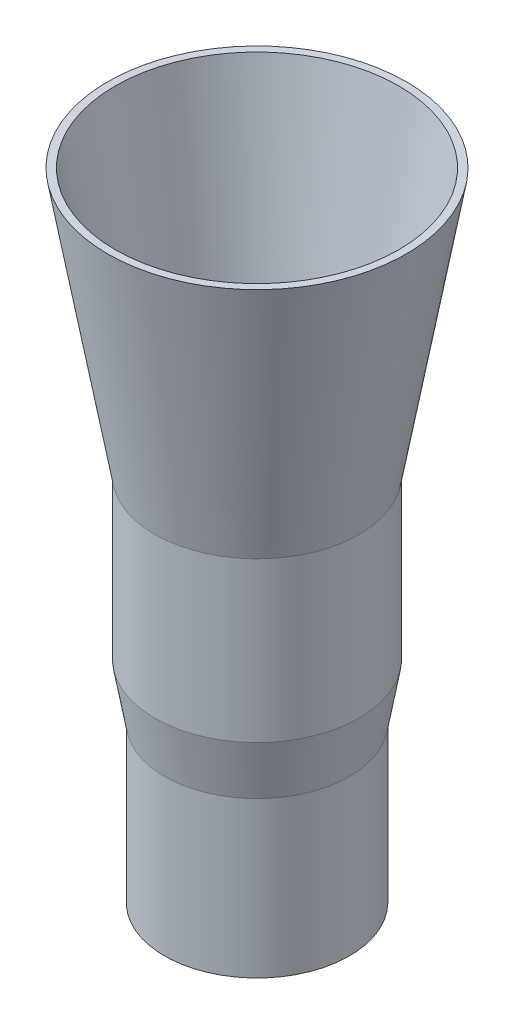
ISO-10303-21;
HEADER;
FILE_DESCRIPTION(('STEP AP214'),'2;1');
FILE_NAME('part.step','',(''),(''),'','','');
FILE_SCHEMA(('AUTOMOTIVE_DESIGN { 1 0 10303 214 1 1 1 1 }'));
ENDSEC;
DATA;
#1=APPLICATION_CONTEXT('core data for automotive mechanical design processes');
#2=APPLICATION_PROTOCOL_DEFINITION('international standard','automotive_design',2000,#1);
#3=PRODUCT_CONTEXT('',#1,'mechanical');
#4=PRODUCT('Part','Part','',(#3));
#5=PRODUCT_RELATED_PRODUCT_CATEGORY('part','',(#4));
#6=PRODUCT_DEFINITION_FORMATION('','',#4);
#7=PRODUCT_DEFINITION_CONTEXT('part definition',#1,'design');
#8=PRODUCT_DEFINITION('design','',#6,#7);
#9=PRODUCT_DEFINITION_SHAPE('','',#8);
#10=(LENGTH_UNIT() NAMED_UNIT(*) SI_UNIT(.MILLI.,.METRE.));
#11=(NAMED_UNIT(*) PLANE_ANGLE_UNIT() SI_UNIT($,.RADIAN.));
#12=(NAMED_UNIT(*) SI_UNIT($,.STERADIAN.) SOLID_ANGLE_UNIT());
#13=UNCERTAINTY_MEASURE_WITH_UNIT(LENGTH_MEASURE(1.E-05),#10,'distance_accuracy_value','');
#14=(GEOMETRIC_REPRESENTATION_CONTEXT(3) GLOBAL_UNCERTAINTY_ASSIGNED_CONTEXT((#13)) GLOBAL_UNIT_ASSIGNED_CONTEXT((#10,
#11,#12)) REPRESENTATION_CONTEXT('',''));
#15=CARTESIAN_POINT('',(0.,0.,0.));
#16=DIRECTION('',(0.,0.,1.));
#17=DIRECTION('',(1.,0.,0.));
#18=AXIS2_PLACEMENT_3D('',#15,#16,#17);
#19=CARTESIAN_POINT('',(0.,0.,0.));
#20=DIRECTION('',(0.,-1.,0.));
#21=DIRECTION('',(0.,0.,-1.));
#22=AXIS2_PLACEMENT_3D('',#19,#20,#21);
#23=PLANE('',#22);
#24=CARTESIAN_POINT('',(0.,0.,0.));
#25=DIRECTION('',(0.,-1.,0.));
#26=DIRECTION('',(0.,0.,-1.));
#27=AXIS2_PLACEMENT_3D('',#24,#25,#26);
#28=CIRCLE('',#27,250.);
#29=CARTESIAN_POINT('',(0.,0.,-250.));
#30=VERTEX_POINT('',#29);
#31=EDGE_CURVE('E10',#30,#30,#28,.T.);
#32=ORIENTED_EDGE('',*,*,#31,.T.);
#33=EDGE_LOOP('',(#32));
#34=FACE_BOUND('',#33,.T.);
#35=ADVANCED_FACE('F37',(#34),#23,.T.);
#36=CARTESIAN_POINT('',(0.,0.,0.));
#37=DIRECTION('',(0.,-1.,0.));
#38=DIRECTION('',(0.,0.,-1.));
#39=AXIS2_PLACEMENT_3D('',#36,#37,#38);
#40=CYLINDRICAL_SURFACE('',#39,250.);
#41=CARTESIAN_POINT('',(0.,420.,0.));
#42=DIRECTION('',(0.,-1.,0.));
#43=DIRECTION('',(0.,0.,-1.));
#44=AXIS2_PLACEMENT_3D('',#41,#42,#43);
#45=CIRCLE('',#44,250.);
#46=CARTESIAN_POINT('',(0.,420.,-250.));
#47=VERTEX_POINT('',#46);
#48=EDGE_CURVE('E44',#47,#47,#45,.T.);
#49=ORIENTED_EDGE('',*,*,#48,.T.);
#50=EDGE_LOOP('',(#49));
#51=FACE_BOUND('',#50,.T.);
#52=ORIENTED_EDGE('',*,*,#31,.F.);
#53=EDGE_LOOP('',(#52));
#54=FACE_BOUND('',#53,.T.);
#55=ADVANCED_FACE('F97',(#51,#54),#40,.T.);
#56=CARTESIAN_POINT('',(0.,420.,0.));
#57=DIRECTION('',(0.,1.,0.));
#58=DIRECTION('',(0.,0.,1.));
#59=AXIS2_PLACEMENT_3D('',#56,#57,#58);
#60=CONICAL_SURFACE('',#59,250.,0.174532925199433);
#61=CARTESIAN_POINT('',(0.,570.,0.));
#62=DIRECTION('',(0.,-1.,0.));
#63=DIRECTION('',(0.,0.,-1.));
#64=AXIS2_PLACEMENT_3D('',#61,#62,#63);
#65=CIRCLE('',#64,276.44904710627);
#66=CARTESIAN_POINT('',(0.,570.,-276.44904710627));
#67=VERTEX_POINT('',#66);
#68=EDGE_CURVE('E49',#67,#67,#65,.T.);
#69=ORIENTED_EDGE('',*,*,#68,.T.);
#70=EDGE_LOOP('',(#69));
#71=FACE_BOUND('',#70,.T.);
#72=ORIENTED_EDGE('',*,*,#48,.F.);
#73=EDGE_LOOP('',(#72));
#74=FACE_BOUND('',#73,.T.);
#75=ADVANCED_FACE('F101',(#71,#74),#60,.T.);
#76=CARTESIAN_POINT('',(0.,0.,0.));
#77=DIRECTION('',(0.,-1.,0.));
#78=DIRECTION('',(0.,0.,-1.));
#79=AXIS2_PLACEMENT_3D('',#76,#77,#78);
#80=CYLINDRICAL_SURFACE('',#79,276.44904710627);
#81=CARTESIAN_POINT('',(0.,1000.,0.));
#82=DIRECTION('',(0.,-1.,0.));
#83=DIRECTION('',(0.,0.,-1.));
#84=AXIS2_PLACEMENT_3D('',#81,#82,#83);
#85=CIRCLE('',#84,276.44904710627);
#86=CARTESIAN_POINT('',(0.,1000.,-276.44904710627));
#87=VERTEX_POINT('',#86);
#88=EDGE_CURVE('E54',#87,#87,#85,.T.);
#89=ORIENTED_EDGE('',*,*,#88,.T.);
#90=EDGE_LOOP('',(#89));
#91=FACE_BOUND('',#90,.T.);
#92=ORIENTED_EDGE('',*,*,#68,.F.);
#93=EDGE_LOOP('',(#92));
#94=FACE_BOUND('',#93,.T.);
#95=ADVANCED_FACE('F105',(#91,#94),#80,.T.);
#96=CARTESIAN_POINT('',(0.,1000.,0.));
#97=DIRECTION('',(0.,1.,0.));
#98=DIRECTION('',(0.,0.,1.));
#99=AXIS2_PLACEMENT_3D('',#96,#97,#98);
#100=CONICAL_SURFACE('',#99,276.44904710627,0.174532925199427);
#101=CARTESIAN_POINT('',(0.,1720.,0.));
#102=DIRECTION('',(0.,-1.,0.));
#103=DIRECTION('',(0.,0.,-1.));
#104=AXIS2_PLACEMENT_3D('',#101,#102,#103);
#105=CIRCLE('',#104,403.40447321636);
#106=CARTESIAN_POINT('',(0.,1720.,-403.40447321636));
#107=VERTEX_POINT('',#106);
#108=EDGE_CURVE('E60',#107,#107,#105,.T.);
#109=ORIENTED_EDGE('',*,*,#108,.T.);
#110=EDGE_LOOP('',(#109));
#111=FACE_BOUND('',#110,.T.);
#112=ORIENTED_EDGE('',*,*,#88,.F.);
#113=EDGE_LOOP('',(#112));
#114=FACE_BOUND('',#113,.T.);
#115=ADVANCED_FACE('F112',(#111,#114),#100,.T.);
#116=CARTESIAN_POINT('',(383.40447321636,1720.,0.));
#117=DIRECTION('',(0.,1.,0.));
#118=DIRECTION('',(0.,0.,1.));
#119=AXIS2_PLACEMENT_3D('',#116,#117,#118);
#120=PLANE('',#119);
#121=CARTESIAN_POINT('',(0.,1720.,0.));
#122=DIRECTION('',(0.,-1.,0.));
#123=DIRECTION('',(0.,0.,-1.));
#124=AXIS2_PLACEMENT_3D('',#121,#122,#123);
#125=CIRCLE('',#124,383.40447321636);
#126=CARTESIAN_POINT('',(0.,1720.,-383.40447321636));
#127=VERTEX_POINT('',#126);
#128=EDGE_CURVE('E64',#127,#127,#125,.T.);
#129=ORIENTED_EDGE('',*,*,#128,.T.);
#130=EDGE_LOOP('',(#129));
#131=FACE_BOUND('',#130,.T.);
#132=ORIENTED_EDGE('',*,*,#108,.F.);
#133=EDGE_LOOP('',(#132));
#134=FACE_BOUND('',#133,.T.);
#135=ADVANCED_FACE('F116',(#131,#134),#120,.T.);
#136=CARTESIAN_POINT('',(0.,1720.,0.));
#137=DIRECTION('',(0.,1.,0.));
#138=DIRECTION('',(0.,0.,1.));
#139=AXIS2_PLACEMENT_3D('',#136,#137,#138);
#140=CONICAL_SURFACE('',#139,383.40447321636,0.174532925199426);
#141=CARTESIAN_POINT('',(0.,1000.,0.));
#142=DIRECTION('',(0.,-1.,0.));
#143=DIRECTION('',(0.,0.,-1.));
#144=AXIS2_PLACEMENT_3D('',#141,#142,#143);
#145=CIRCLE('',#144,256.44904710627);
#146=CARTESIAN_POINT('',(0.,1000.,-256.44904710627));
#147=VERTEX_POINT('',#146);
#148=EDGE_CURVE('E68',#147,#147,#145,.T.);
#149=ORIENTED_EDGE('',*,*,#148,.T.);
#150=EDGE_LOOP('',(#149));
#151=FACE_BOUND('',#150,.T.);
#152=ORIENTED_EDGE('',*,*,#128,.F.);
#153=EDGE_LOOP('',(#152));
#154=FACE_BOUND('',#153,.T.);
#155=ADVANCED_FACE('F120',(#151,#154),#140,.F.);
#156=CARTESIAN_POINT('',(0.,0.,0.));
#157=DIRECTION('',(0.,-1.,0.));
#158=DIRECTION('',(0.,0.,-1.));
#159=AXIS2_PLACEMENT_3D('',#156,#157,#158);
#160=CYLINDRICAL_SURFACE('',#159,256.44904710627);
#161=CARTESIAN_POINT('',(0.,570.,0.));
#162=DIRECTION('',(0.,-1.,0.));
#163=DIRECTION('',(0.,0.,-1.));
#164=AXIS2_PLACEMENT_3D('',#161,#162,#163);
#165=CIRCLE('',#164,256.44904710627);
#166=CARTESIAN_POINT('',(0.,570.,-256.44904710627));
#167=VERTEX_POINT('',#166);
#168=EDGE_CURVE('E72',#167,#167,#165,.T.);
#169=ORIENTED_EDGE('',*,*,#168,.T.);
#170=EDGE_LOOP('',(#169));
#171=FACE_BOUND('',#170,.T.);
#172=ORIENTED_EDGE('',*,*,#148,.F.);
#173=EDGE_LOOP('',(#172));
#174=FACE_BOUND('',#173,.T.);
#175=ADVANCED_FACE('F124',(#171,#174),#160,.F.);
#176=CARTESIAN_POINT('',(0.,570.,0.));
#177=DIRECTION('',(0.,1.,0.));
#178=DIRECTION('',(0.,0.,1.));
#179=AXIS2_PLACEMENT_3D('',#176,#177,#178);
#180=CONICAL_SURFACE('',#179,256.44904710627,0.174532925199434);
#181=CARTESIAN_POINT('',(0.,420.,0.));
#182=DIRECTION('',(0.,-1.,0.));
#183=DIRECTION('',(0.,0.,-1.));
#184=AXIS2_PLACEMENT_3D('',#181,#182,#183);
#185=CIRCLE('',#184,230.);
#186=CARTESIAN_POINT('',(0.,420.,-230.));
#187=VERTEX_POINT('',#186);
#188=EDGE_CURVE('E76',#187,#187,#185,.T.);
#189=ORIENTED_EDGE('',*,*,#188,.T.);
#190=EDGE_LOOP('',(#189));
#191=FACE_BOUND('',#190,.T.);
#192=ORIENTED_EDGE('',*,*,#168,.F.);
#193=EDGE_LOOP('',(#192));
#194=FACE_BOUND('',#193,.T.);
#195=ADVANCED_FACE('F94',(#191,#194),#180,.F.);
#196=CARTESIAN_POINT('',(0.,0.,0.));
#197=DIRECTION('',(0.,-1.,0.));
#198=DIRECTION('',(0.,0.,-1.));
#199=AXIS2_PLACEMENT_3D('',#196,#197,#198);
#200=CYLINDRICAL_SURFACE('',#199,230.);
#201=CARTESIAN_POINT('',(0.,20.,0.));
#202=DIRECTION('',(0.,-1.,0.));
#203=DIRECTION('',(0.,0.,-1.));
#204=AXIS2_PLACEMENT_3D('',#201,#202,#203);
#205=CIRCLE('',#204,230.);
#206=CARTESIAN_POINT('',(0.,20.,-230.));
#207=VERTEX_POINT('',#206);
#208=EDGE_CURVE('E80',#207,#207,#205,.T.);
#209=ORIENTED_EDGE('',*,*,#208,.T.);
#210=EDGE_LOOP('',(#209));
#211=FACE_BOUND('',#210,.T.);
#212=ORIENTED_EDGE('',*,*,#188,.F.);
#213=EDGE_LOOP('',(#212));
#214=FACE_BOUND('',#213,.T.);
#215=ADVANCED_FACE('F85',(#211,#214),#200,.F.);
#216=CARTESIAN_POINT('',(230.,20.,0.));
#217=DIRECTION('',(0.,1.,0.));
#218=DIRECTION('',(0.,0.,1.));
#219=AXIS2_PLACEMENT_3D('',#216,#217,#218);
#220=PLANE('',#219);
#221=ORIENTED_EDGE('',*,*,#208,.F.);
#222=EDGE_LOOP('',(#221));
#223=FACE_BOUND('',#222,.T.);
#224=ADVANCED_FACE('F88',(#223),#220,.T.);
#225=CLOSED_SHELL('',(#35,#55,#75,#95,#115,#135,#155,#175,#195,#215,#224));
#226=MANIFOLD_SOLID_BREP('B2',#225);
#227=ADVANCED_BREP_SHAPE_REPRESENTATION('',(#18,#226),#14);
#228=SHAPE_DEFINITION_REPRESENTATION(#9,#227);
ENDSEC;
END-ISO-10303-21;
